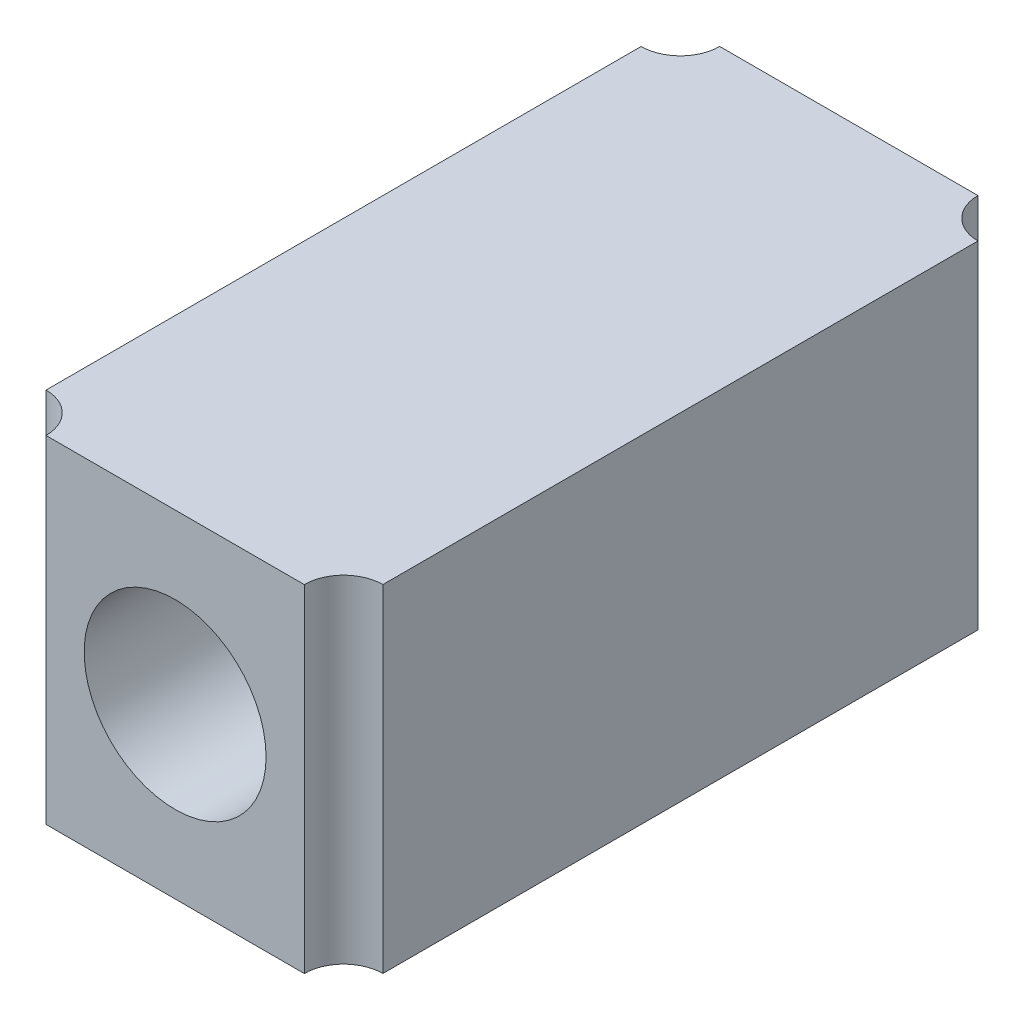
ISO-10303-21;
HEADER;
FILE_DESCRIPTION(('STEP AP214'),'2;1');
FILE_NAME('part.step','',(''),(''),'','','');
FILE_SCHEMA(('AUTOMOTIVE_DESIGN { 1 0 10303 214 1 1 1 1 }'));
ENDSEC;
DATA;
#1=APPLICATION_CONTEXT('core data for automotive mechanical design processes');
#2=APPLICATION_PROTOCOL_DEFINITION('international standard','automotive_design',2000,#1);
#3=PRODUCT_CONTEXT('',#1,'mechanical');
#4=PRODUCT('Part','Part','',(#3));
#5=PRODUCT_RELATED_PRODUCT_CATEGORY('part','',(#4));
#6=PRODUCT_DEFINITION_FORMATION('','',#4);
#7=PRODUCT_DEFINITION_CONTEXT('part definition',#1,'design');
#8=PRODUCT_DEFINITION('design','',#6,#7);
#9=PRODUCT_DEFINITION_SHAPE('','',#8);
#10=(LENGTH_UNIT() NAMED_UNIT(*) SI_UNIT(.MILLI.,.METRE.));
#11=(NAMED_UNIT(*) PLANE_ANGLE_UNIT() SI_UNIT($,.RADIAN.));
#12=(NAMED_UNIT(*) SI_UNIT($,.STERADIAN.) SOLID_ANGLE_UNIT());
#13=UNCERTAINTY_MEASURE_WITH_UNIT(LENGTH_MEASURE(1.E-05),#10,'distance_accuracy_value','');
#14=(GEOMETRIC_REPRESENTATION_CONTEXT(3) GLOBAL_UNCERTAINTY_ASSIGNED_CONTEXT((#13)) GLOBAL_UNIT_ASSIGNED_CONTEXT((#10,
#11,#12)) REPRESENTATION_CONTEXT('',''));
#15=CARTESIAN_POINT('',(0.,0.,0.));
#16=DIRECTION('',(0.,0.,1.));
#17=DIRECTION('',(1.,0.,0.));
#18=AXIS2_PLACEMENT_3D('',#15,#16,#17);
#19=CARTESIAN_POINT('',(0.,0.,30.));
#20=DIRECTION('',(0.,0.,-1.));
#21=DIRECTION('',(-1.,0.,0.));
#22=AXIS2_PLACEMENT_3D('',#19,#20,#21);
#23=PLANE('',#22);
#24=DIRECTION('',(-1.,0.,0.));
#25=VECTOR('',#24,1.);
#26=CARTESIAN_POINT('',(-7.5,7.5,30.));
#27=LINE('',#26,#25);
#28=CARTESIAN_POINT('',(5.75,7.5,30.));
#29=VERTEX_POINT('',#28);
#30=CARTESIAN_POINT('',(-5.75,7.5,30.));
#31=VERTEX_POINT('',#30);
#32=EDGE_CURVE('E112',#29,#31,#27,.T.);
#33=ORIENTED_EDGE('',*,*,#32,.T.);
#34=DIRECTION('',(0.,1.,0.));
#35=VECTOR('',#34,1.);
#36=CARTESIAN_POINT('',(-5.75,-7.5,30.));
#37=LINE('',#36,#35);
#38=CARTESIAN_POINT('',(-5.75,-7.5,30.));
#39=VERTEX_POINT('',#38);
#40=EDGE_CURVE('E98',#31,#39,#37,.F.);
#41=ORIENTED_EDGE('',*,*,#40,.T.);
#42=DIRECTION('',(1.,0.,0.));
#43=VECTOR('',#42,1.);
#44=CARTESIAN_POINT('',(-7.5,-7.5,30.));
#45=LINE('',#44,#43);
#46=CARTESIAN_POINT('',(5.75,-7.5,30.));
#47=VERTEX_POINT('',#46);
#48=EDGE_CURVE('E109',#39,#47,#45,.T.);
#49=ORIENTED_EDGE('',*,*,#48,.T.);
#50=DIRECTION('',(0.,1.,0.));
#51=VECTOR('',#50,1.);
#52=CARTESIAN_POINT('',(5.75,-7.5,30.));
#53=LINE('',#52,#51);
#54=EDGE_CURVE('E161',#47,#29,#53,.T.);
#55=ORIENTED_EDGE('',*,*,#54,.T.);
#56=EDGE_LOOP('',(#33,#41,#49,#55));
#57=FACE_BOUND('',#56,.T.);
#58=CARTESIAN_POINT('',(0.,0.,30.));
#59=DIRECTION('',(0.,0.,1.));
#60=DIRECTION('',(1.,0.,0.));
#61=AXIS2_PLACEMENT_3D('',#58,#59,#60);
#62=CIRCLE('',#61,4.05);
#63=CARTESIAN_POINT('',(4.05,0.,30.));
#64=VERTEX_POINT('',#63);
#65=EDGE_CURVE('E131',#64,#64,#62,.T.);
#66=ORIENTED_EDGE('',*,*,#65,.F.);
#67=EDGE_LOOP('',(#66));
#68=FACE_BOUND('',#67,.T.);
#69=ADVANCED_FACE('F32',(#57,#68),#23,.F.);
#70=CARTESIAN_POINT('',(0.,0.,0.));
#71=DIRECTION('',(0.,0.,-1.));
#72=DIRECTION('',(-1.,0.,0.));
#73=AXIS2_PLACEMENT_3D('',#70,#71,#72);
#74=PLANE('',#73);
#75=DIRECTION('',(0.,1.,0.));
#76=VECTOR('',#75,1.);
#77=CARTESIAN_POINT('',(-5.75,-7.5,0.));
#78=LINE('',#77,#76);
#79=CARTESIAN_POINT('',(-5.75,7.5,0.));
#80=VERTEX_POINT('',#79);
#81=CARTESIAN_POINT('',(-5.75,-7.5,0.));
#82=VERTEX_POINT('',#81);
#83=EDGE_CURVE('E55',#80,#82,#78,.F.);
#84=ORIENTED_EDGE('',*,*,#83,.F.);
#85=DIRECTION('',(-1.,0.,0.));
#86=VECTOR('',#85,1.);
#87=CARTESIAN_POINT('',(-7.5,7.5,0.));
#88=LINE('',#87,#86);
#89=CARTESIAN_POINT('',(5.75,7.5,0.));
#90=VERTEX_POINT('',#89);
#91=EDGE_CURVE('E128',#90,#80,#88,.T.);
#92=ORIENTED_EDGE('',*,*,#91,.F.);
#93=DIRECTION('',(0.,1.,0.));
#94=VECTOR('',#93,1.);
#95=CARTESIAN_POINT('',(5.75,-7.5,0.));
#96=LINE('',#95,#94);
#97=CARTESIAN_POINT('',(5.75,-7.5,0.));
#98=VERTEX_POINT('',#97);
#99=EDGE_CURVE('E152',#98,#90,#96,.T.);
#100=ORIENTED_EDGE('',*,*,#99,.F.);
#101=DIRECTION('',(1.,0.,0.));
#102=VECTOR('',#101,1.);
#103=CARTESIAN_POINT('',(-7.5,-7.5,0.));
#104=LINE('',#103,#102);
#105=EDGE_CURVE('E124',#82,#98,#104,.T.);
#106=ORIENTED_EDGE('',*,*,#105,.F.);
#107=EDGE_LOOP('',(#84,#92,#100,#106));
#108=FACE_BOUND('',#107,.T.);
#109=CARTESIAN_POINT('',(0.,0.,0.));
#110=DIRECTION('',(0.,0.,1.));
#111=DIRECTION('',(1.,0.,0.));
#112=AXIS2_PLACEMENT_3D('',#109,#110,#111);
#113=CIRCLE('',#112,4.05);
#114=CARTESIAN_POINT('',(4.05,0.,0.));
#115=VERTEX_POINT('',#114);
#116=EDGE_CURVE('E163',#115,#115,#113,.T.);
#117=ORIENTED_EDGE('',*,*,#116,.T.);
#118=EDGE_LOOP('',(#117));
#119=FACE_BOUND('',#118,.T.);
#120=ADVANCED_FACE('F168',(#108,#119),#74,.T.);
#121=CARTESIAN_POINT('',(7.5,-7.5,30.));
#122=DIRECTION('',(-1.,0.,0.));
#123=DIRECTION('',(0.,0.,1.));
#124=AXIS2_PLACEMENT_3D('',#121,#122,#123);
#125=PLANE('',#124);
#126=DIRECTION('',(0.,0.,-1.));
#127=VECTOR('',#126,1.);
#128=CARTESIAN_POINT('',(7.5,-7.5,30.));
#129=LINE('',#128,#127);
#130=CARTESIAN_POINT('',(7.5,-7.5,28.25));
#131=VERTEX_POINT('',#130);
#132=CARTESIAN_POINT('',(7.5,-7.5,1.75));
#133=VERTEX_POINT('',#132);
#134=EDGE_CURVE('E119',#131,#133,#129,.T.);
#135=ORIENTED_EDGE('',*,*,#134,.T.);
#136=DIRECTION('',(0.,1.,0.));
#137=VECTOR('',#136,1.);
#138=CARTESIAN_POINT('',(7.5,-7.5,1.75));
#139=LINE('',#138,#137);
#140=CARTESIAN_POINT('',(7.5,7.5,1.75));
#141=VERTEX_POINT('',#140);
#142=EDGE_CURVE('E149',#133,#141,#139,.T.);
#143=ORIENTED_EDGE('',*,*,#142,.T.);
#144=DIRECTION('',(0.,0.,-1.));
#145=VECTOR('',#144,1.);
#146=CARTESIAN_POINT('',(7.5,7.5,30.));
#147=LINE('',#146,#145);
#148=CARTESIAN_POINT('',(7.5,7.5,28.25));
#149=VERTEX_POINT('',#148);
#150=EDGE_CURVE('E40',#149,#141,#147,.T.);
#151=ORIENTED_EDGE('',*,*,#150,.F.);
#152=DIRECTION('',(0.,1.,0.));
#153=VECTOR('',#152,1.);
#154=CARTESIAN_POINT('',(7.5,-7.5,28.25));
#155=LINE('',#154,#153);
#156=EDGE_CURVE('E148',#149,#131,#155,.F.);
#157=ORIENTED_EDGE('',*,*,#156,.T.);
#158=EDGE_LOOP('',(#135,#143,#151,#157));
#159=FACE_BOUND('',#158,.T.);
#160=ADVANCED_FACE('F34',(#159),#125,.F.);
#161=CARTESIAN_POINT('',(-7.5,7.5,30.));
#162=DIRECTION('',(0.,-1.,0.));
#163=DIRECTION('',(0.,0.,-1.));
#164=AXIS2_PLACEMENT_3D('',#161,#162,#163);
#165=PLANE('',#164);
#166=DIRECTION('',(0.,0.,-1.));
#167=VECTOR('',#166,1.);
#168=CARTESIAN_POINT('',(-7.5,7.5,30.));
#169=LINE('',#168,#167);
#170=CARTESIAN_POINT('',(-7.5,7.5,28.25));
#171=VERTEX_POINT('',#170);
#172=CARTESIAN_POINT('',(-7.5,7.5,1.75));
#173=VERTEX_POINT('',#172);
#174=EDGE_CURVE('E134',#171,#173,#169,.T.);
#175=ORIENTED_EDGE('',*,*,#174,.F.);
#176=CARTESIAN_POINT('',(-7.5,7.5,30.));
#177=DIRECTION('',(0.,1.,0.));
#178=DIRECTION('',(0.,0.,1.));
#179=AXIS2_PLACEMENT_3D('',#176,#177,#178);
#180=CIRCLE('',#179,1.75);
#181=EDGE_CURVE('E103',#31,#171,#180,.T.);
#182=ORIENTED_EDGE('',*,*,#181,.F.);
#183=ORIENTED_EDGE('',*,*,#32,.F.);
#184=CARTESIAN_POINT('',(7.5,7.5,30.));
#185=DIRECTION('',(0.,1.,0.));
#186=DIRECTION('',(0.,0.,1.));
#187=AXIS2_PLACEMENT_3D('',#184,#185,#186);
#188=CIRCLE('',#187,1.75);
#189=EDGE_CURVE('E144',#149,#29,#188,.T.);
#190=ORIENTED_EDGE('',*,*,#189,.F.);
#191=ORIENTED_EDGE('',*,*,#150,.T.);
#192=CARTESIAN_POINT('',(7.5,7.5,0.));
#193=DIRECTION('',(0.,1.,0.));
#194=DIRECTION('',(0.,0.,1.));
#195=AXIS2_PLACEMENT_3D('',#192,#193,#194);
#196=CIRCLE('',#195,1.75);
#197=EDGE_CURVE('E142',#90,#141,#196,.T.);
#198=ORIENTED_EDGE('',*,*,#197,.F.);
#199=ORIENTED_EDGE('',*,*,#91,.T.);
#200=CARTESIAN_POINT('',(-7.5,7.5,0.));
#201=DIRECTION('',(0.,1.,0.));
#202=DIRECTION('',(0.,0.,1.));
#203=AXIS2_PLACEMENT_3D('',#200,#201,#202);
#204=CIRCLE('',#203,1.75);
#205=EDGE_CURVE('E113',#173,#80,#204,.T.);
#206=ORIENTED_EDGE('',*,*,#205,.F.);
#207=EDGE_LOOP('',(#175,#182,#183,#190,#191,#198,#199,#206));
#208=FACE_BOUND('',#207,.T.);
#209=ADVANCED_FACE('F141',(#208),#165,.F.);
#210=CARTESIAN_POINT('',(-7.5,-7.5,30.));
#211=DIRECTION('',(1.,0.,0.));
#212=DIRECTION('',(0.,0.,-1.));
#213=AXIS2_PLACEMENT_3D('',#210,#211,#212);
#214=PLANE('',#213);
#215=DIRECTION('',(0.,0.,-1.));
#216=VECTOR('',#215,1.);
#217=CARTESIAN_POINT('',(-7.5,-7.5,30.));
#218=LINE('',#217,#216);
#219=CARTESIAN_POINT('',(-7.5,-7.5,28.25));
#220=VERTEX_POINT('',#219);
#221=CARTESIAN_POINT('',(-7.5,-7.5,1.75));
#222=VERTEX_POINT('',#221);
#223=EDGE_CURVE('E122',#220,#222,#218,.T.);
#224=ORIENTED_EDGE('',*,*,#223,.F.);
#225=DIRECTION('',(0.,1.,0.));
#226=VECTOR('',#225,1.);
#227=CARTESIAN_POINT('',(-7.5,-7.5,28.25));
#228=LINE('',#227,#226);
#229=EDGE_CURVE('E47',#220,#171,#228,.T.);
#230=ORIENTED_EDGE('',*,*,#229,.T.);
#231=ORIENTED_EDGE('',*,*,#174,.T.);
#232=DIRECTION('',(0.,1.,0.));
#233=VECTOR('',#232,1.);
#234=CARTESIAN_POINT('',(-7.5,-7.5,1.75));
#235=LINE('',#234,#233);
#236=EDGE_CURVE('E258',#173,#222,#235,.F.);
#237=ORIENTED_EDGE('',*,*,#236,.T.);
#238=EDGE_LOOP('',(#224,#230,#231,#237));
#239=FACE_BOUND('',#238,.T.);
#240=ADVANCED_FACE('F182',(#239),#214,.F.);
#241=CARTESIAN_POINT('',(-7.5,-7.5,30.));
#242=DIRECTION('',(0.,1.,0.));
#243=DIRECTION('',(0.,0.,1.));
#244=AXIS2_PLACEMENT_3D('',#241,#242,#243);
#245=PLANE('',#244);
#246=ORIENTED_EDGE('',*,*,#48,.F.);
#247=CARTESIAN_POINT('',(-7.5,-7.5,30.));
#248=DIRECTION('',(0.,1.,0.));
#249=DIRECTION('',(0.,0.,1.));
#250=AXIS2_PLACEMENT_3D('',#247,#248,#249);
#251=CIRCLE('',#250,1.75);
#252=EDGE_CURVE('E95',#39,#220,#251,.T.);
#253=ORIENTED_EDGE('',*,*,#252,.T.);
#254=ORIENTED_EDGE('',*,*,#223,.T.);
#255=CARTESIAN_POINT('',(-7.5,-7.5,0.));
#256=DIRECTION('',(0.,1.,0.));
#257=DIRECTION('',(0.,0.,1.));
#258=AXIS2_PLACEMENT_3D('',#255,#256,#257);
#259=CIRCLE('',#258,1.75);
#260=EDGE_CURVE('E256',#222,#82,#259,.T.);
#261=ORIENTED_EDGE('',*,*,#260,.T.);
#262=ORIENTED_EDGE('',*,*,#105,.T.);
#263=CARTESIAN_POINT('',(7.5,-7.5,0.));
#264=DIRECTION('',(0.,1.,0.));
#265=DIRECTION('',(0.,0.,1.));
#266=AXIS2_PLACEMENT_3D('',#263,#264,#265);
#267=CIRCLE('',#266,1.75);
#268=EDGE_CURVE('E11',#98,#133,#267,.T.);
#269=ORIENTED_EDGE('',*,*,#268,.T.);
#270=ORIENTED_EDGE('',*,*,#134,.F.);
#271=CARTESIAN_POINT('',(7.5,-7.5,30.));
#272=DIRECTION('',(0.,1.,0.));
#273=DIRECTION('',(0.,0.,1.));
#274=AXIS2_PLACEMENT_3D('',#271,#272,#273);
#275=CIRCLE('',#274,1.75);
#276=EDGE_CURVE('E118',#131,#47,#275,.T.);
#277=ORIENTED_EDGE('',*,*,#276,.T.);
#278=EDGE_LOOP('',(#246,#253,#254,#261,#262,#269,#270,#277));
#279=FACE_BOUND('',#278,.T.);
#280=ADVANCED_FACE('F116',(#279),#245,.F.);
#281=CARTESIAN_POINT('',(0.,0.,30.));
#282=DIRECTION('',(0.,0.,-1.));
#283=DIRECTION('',(-1.,0.,0.));
#284=AXIS2_PLACEMENT_3D('',#281,#282,#283);
#285=CYLINDRICAL_SURFACE('',#284,4.05);
#286=ORIENTED_EDGE('',*,*,#65,.T.);
#287=EDGE_LOOP('',(#286));
#288=FACE_BOUND('',#287,.T.);
#289=ORIENTED_EDGE('',*,*,#116,.F.);
#290=EDGE_LOOP('',(#289));
#291=FACE_BOUND('',#290,.T.);
#292=ADVANCED_FACE('F170',(#288,#291),#285,.F.);
#293=CARTESIAN_POINT('',(7.5,-7.5,30.));
#294=DIRECTION('',(0.,1.,0.));
#295=DIRECTION('',(0.,0.,1.));
#296=AXIS2_PLACEMENT_3D('',#293,#294,#295);
#297=CYLINDRICAL_SURFACE('',#296,1.75);
#298=ORIENTED_EDGE('',*,*,#276,.F.);
#299=ORIENTED_EDGE('',*,*,#156,.F.);
#300=ORIENTED_EDGE('',*,*,#189,.T.);
#301=ORIENTED_EDGE('',*,*,#54,.F.);
#302=EDGE_LOOP('',(#298,#299,#300,#301));
#303=FACE_BOUND('',#302,.T.);
#304=ADVANCED_FACE('F172',(#303),#297,.F.);
#305=CARTESIAN_POINT('',(7.5,-7.5,0.));
#306=DIRECTION('',(0.,1.,0.));
#307=DIRECTION('',(0.,0.,1.));
#308=AXIS2_PLACEMENT_3D('',#305,#306,#307);
#309=CYLINDRICAL_SURFACE('',#308,1.75);
#310=ORIENTED_EDGE('',*,*,#99,.T.);
#311=ORIENTED_EDGE('',*,*,#197,.T.);
#312=ORIENTED_EDGE('',*,*,#142,.F.);
#313=ORIENTED_EDGE('',*,*,#268,.F.);
#314=EDGE_LOOP('',(#310,#311,#312,#313));
#315=FACE_BOUND('',#314,.T.);
#316=ADVANCED_FACE('F179',(#315),#309,.F.);
#317=CARTESIAN_POINT('',(-7.5,-7.5,0.));
#318=DIRECTION('',(0.,1.,0.));
#319=DIRECTION('',(0.,0.,1.));
#320=AXIS2_PLACEMENT_3D('',#317,#318,#319);
#321=CYLINDRICAL_SURFACE('',#320,1.75);
#322=ORIENTED_EDGE('',*,*,#83,.T.);
#323=ORIENTED_EDGE('',*,*,#260,.F.);
#324=ORIENTED_EDGE('',*,*,#236,.F.);
#325=ORIENTED_EDGE('',*,*,#205,.T.);
#326=EDGE_LOOP('',(#322,#323,#324,#325));
#327=FACE_BOUND('',#326,.T.);
#328=ADVANCED_FACE('F232',(#327),#321,.F.);
#329=CARTESIAN_POINT('',(-7.5,-7.5,30.));
#330=DIRECTION('',(0.,1.,0.));
#331=DIRECTION('',(0.,0.,1.));
#332=AXIS2_PLACEMENT_3D('',#329,#330,#331);
#333=CYLINDRICAL_SURFACE('',#332,1.75);
#334=ORIENTED_EDGE('',*,*,#181,.T.);
#335=ORIENTED_EDGE('',*,*,#229,.F.);
#336=ORIENTED_EDGE('',*,*,#252,.F.);
#337=ORIENTED_EDGE('',*,*,#40,.F.);
#338=EDGE_LOOP('',(#334,#335,#336,#337));
#339=FACE_BOUND('',#338,.T.);
#340=ADVANCED_FACE('F97',(#339),#333,.F.);
#341=CLOSED_SHELL('',(#69,#120,#160,#209,#240,#280,#292,#304,#316,#328,#340));
#342=MANIFOLD_SOLID_BREP('B2',#341);
#343=ADVANCED_BREP_SHAPE_REPRESENTATION('',(#18,#342),#14);
#344=SHAPE_DEFINITION_REPRESENTATION(#9,#343);
ENDSEC;
END-ISO-10303-21;
